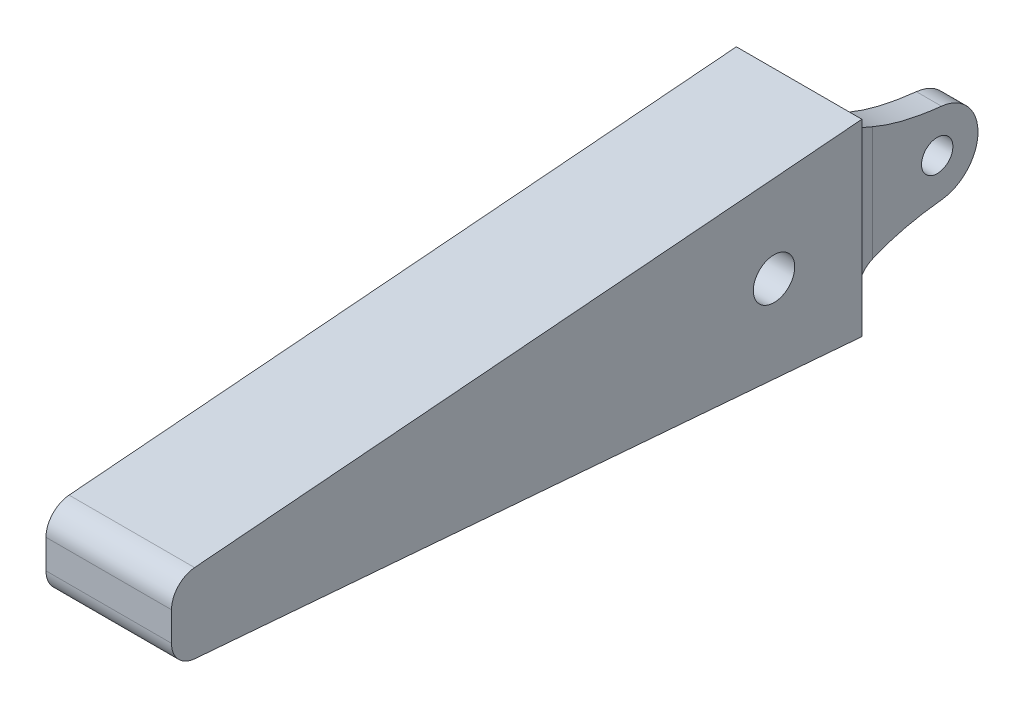
ISO-10303-21;
HEADER;
FILE_DESCRIPTION(('STEP AP214'),'2;1');
FILE_NAME('part.step','',(''),(''),'','','');
FILE_SCHEMA(('AUTOMOTIVE_DESIGN { 1 0 10303 214 1 1 1 1 }'));
ENDSEC;
DATA;
#1=APPLICATION_CONTEXT('core data for automotive mechanical design processes');
#2=APPLICATION_PROTOCOL_DEFINITION('international standard','automotive_design',2000,#1);
#3=PRODUCT_CONTEXT('',#1,'mechanical');
#4=PRODUCT('Part','Part','',(#3));
#5=PRODUCT_RELATED_PRODUCT_CATEGORY('part','',(#4));
#6=PRODUCT_DEFINITION_FORMATION('','',#4);
#7=PRODUCT_DEFINITION_CONTEXT('part definition',#1,'design');
#8=PRODUCT_DEFINITION('design','',#6,#7);
#9=PRODUCT_DEFINITION_SHAPE('','',#8);
#10=(LENGTH_UNIT() NAMED_UNIT(*) SI_UNIT(.MILLI.,.METRE.));
#11=(NAMED_UNIT(*) PLANE_ANGLE_UNIT() SI_UNIT($,.RADIAN.));
#12=(NAMED_UNIT(*) SI_UNIT($,.STERADIAN.) SOLID_ANGLE_UNIT());
#13=UNCERTAINTY_MEASURE_WITH_UNIT(LENGTH_MEASURE(1.E-05),#10,'distance_accuracy_value','');
#14=(GEOMETRIC_REPRESENTATION_CONTEXT(3) GLOBAL_UNCERTAINTY_ASSIGNED_CONTEXT((#13)) GLOBAL_UNIT_ASSIGNED_CONTEXT((#10,
#11,#12)) REPRESENTATION_CONTEXT('',''));
#15=CARTESIAN_POINT('',(0.,0.,0.));
#16=DIRECTION('',(0.,0.,1.));
#17=DIRECTION('',(1.,0.,0.));
#18=AXIS2_PLACEMENT_3D('',#15,#16,#17);
#19=CARTESIAN_POINT('',(0.,7.5,-66.25));
#20=DIRECTION('',(-1.,0.,0.));
#21=DIRECTION('',(0.,0.,-1.));
#22=AXIS2_PLACEMENT_3D('',#19,#20,#21);
#23=PLANE('',#22);
#24=CARTESIAN_POINT('',(0.,0.,-48.));
#25=DIRECTION('',(-1.,0.,0.));
#26=DIRECTION('',(0.,0.,1.));
#27=AXIS2_PLACEMENT_3D('',#24,#25,#26);
#28=CIRCLE('',#27,1.65);
#29=CARTESIAN_POINT('',(0.,0.,-46.35));
#30=VERTEX_POINT('',#29);
#31=EDGE_CURVE('E192',#30,#30,#28,.T.);
#32=ORIENTED_EDGE('',*,*,#31,.F.);
#33=EDGE_LOOP('',(#32));
#34=FACE_BOUND('',#33,.T.);
#35=DIRECTION('',(0.,0.0815456948772206,0.99666960405492));
#36=VECTOR('',#35,1.);
#37=CARTESIAN_POINT('',(0.,-3.,0.));
#38=LINE('',#37,#36);
#39=CARTESIAN_POINT('',(0.,-7.5,-55.));
#40=VERTEX_POINT('',#39);
#41=CARTESIAN_POINT('',(0.,-3.15029252265645,-1.83690861024556));
#42=VERTEX_POINT('',#41);
#43=EDGE_CURVE('E196',#40,#42,#38,.T.);
#44=ORIENTED_EDGE('',*,*,#43,.T.);
#45=CARTESIAN_POINT('',(0.,-1.15695331454661,-2.));
#46=DIRECTION('',(1.,0.,0.));
#47=DIRECTION('',(0.,0.,-1.));
#48=AXIS2_PLACEMENT_3D('',#45,#46,#47);
#49=CIRCLE('',#48,2.);
#50=CARTESIAN_POINT('',(0.,-1.15695331454661,0.));
#51=VERTEX_POINT('',#50);
#52=EDGE_CURVE('E298',#51,#42,#49,.T.);
#53=ORIENTED_EDGE('',*,*,#52,.F.);
#54=DIRECTION('',(0.,1.,0.));
#55=VECTOR('',#54,1.);
#56=CARTESIAN_POINT('',(0.,3.,0.));
#57=LINE('',#56,#55);
#58=CARTESIAN_POINT('',(0.,1.15695331454661,0.));
#59=VERTEX_POINT('',#58);
#60=EDGE_CURVE('E282',#51,#59,#57,.T.);
#61=ORIENTED_EDGE('',*,*,#60,.T.);
#62=CARTESIAN_POINT('',(0.,1.15695331454661,-2.));
#63=DIRECTION('',(1.,0.,0.));
#64=DIRECTION('',(0.,0.,-1.));
#65=AXIS2_PLACEMENT_3D('',#62,#63,#64);
#66=CIRCLE('',#65,2.);
#67=CARTESIAN_POINT('',(0.,3.15029252265645,-1.83690861024556));
#68=VERTEX_POINT('',#67);
#69=EDGE_CURVE('E300',#68,#59,#66,.T.);
#70=ORIENTED_EDGE('',*,*,#69,.F.);
#71=DIRECTION('',(0.,0.0815456948772208,-0.99666960405492));
#72=VECTOR('',#71,1.);
#73=CARTESIAN_POINT('',(0.,3.,0.));
#74=LINE('',#73,#72);
#75=CARTESIAN_POINT('',(0.,7.5,-55.));
#76=VERTEX_POINT('',#75);
#77=EDGE_CURVE('E150',#68,#76,#74,.T.);
#78=ORIENTED_EDGE('',*,*,#77,.T.);
#79=DIRECTION('',(0.,1.,0.));
#80=VECTOR('',#79,1.);
#81=CARTESIAN_POINT('',(0.,-7.5,-55.));
#82=LINE('',#81,#80);
#83=EDGE_CURVE('E176',#40,#76,#82,.T.);
#84=ORIENTED_EDGE('',*,*,#83,.F.);
#85=EDGE_LOOP('',(#44,#53,#61,#70,#78,#84));
#86=FACE_BOUND('',#85,.T.);
#87=ADVANCED_FACE('F43',(#34,#86),#23,.T.);
#88=CARTESIAN_POINT('',(10.,7.5,-66.25));
#89=DIRECTION('',(1.,0.,0.));
#90=DIRECTION('',(0.,0.,1.));
#91=AXIS2_PLACEMENT_3D('',#88,#89,#90);
#92=ELLIPSE('',#91,11.25,4.41819971046751);
#93=DIRECTION('',(-1.,0.,0.));
#94=VECTOR('',#93,1.);
#95=SURFACE_OF_LINEAR_EXTRUSION('',#92,#94);
#96=DIRECTION('',(-1.,0.,0.));
#97=VECTOR('',#96,1.);
#98=CARTESIAN_POINT('',(10.,7.5,-55.));
#99=LINE('',#98,#97);
#100=CARTESIAN_POINT('',(10.,7.5,-55.));
#101=VERTEX_POINT('',#100);
#102=CARTESIAN_POINT('',(3.,7.5,-55.));
#103=VERTEX_POINT('',#102);
#104=EDGE_CURVE('E162',#101,#103,#99,.T.);
#105=ORIENTED_EDGE('',*,*,#104,.F.);
#106=CARTESIAN_POINT('',(8.,4.57055829430097,-57.8284271247462));
#107=CARTESIAN_POINT('',(7.99998641205141,4.61231170109874,-57.7342422779334));
#108=CARTESIAN_POINT('',(8.00443401800137,4.65539920261651,-57.6406771728708));
#109=CARTESIAN_POINT('',(8.0218085903429,4.74410025255541,-57.4556214074317));
#110=CARTESIAN_POINT('',(8.03473023746272,4.78971219991298,-57.3641294829392));
#111=CARTESIAN_POINT('',(8.06852166861428,4.88312584875049,-57.1844097968949));
#112=CARTESIAN_POINT('',(8.08934920522048,4.93091474283163,-57.0961673736677));
#113=CARTESIAN_POINT('',(8.13845260187995,5.02879468476102,-56.9230886279007));
#114=CARTESIAN_POINT('',(8.16672944264326,5.07888603501311,-56.8382527555335));
#115=CARTESIAN_POINT('',(8.23010184643626,5.18112614627208,-56.6727915203997));
#116=CARTESIAN_POINT('',(8.26518003899859,5.23326940194271,-56.5921560816965));
#117=CARTESIAN_POINT('',(8.3416217947351,5.33963951642925,-56.4353610765376));
#118=CARTESIAN_POINT('',(8.38298582494217,5.39386652984289,-56.3592018432442));
#119=CARTESIAN_POINT('',(8.47147304169255,5.50443663296145,-56.2116507095304));
#120=CARTESIAN_POINT('',(8.5186074136953,5.56078368104042,-56.1402684967307));
#121=CARTESIAN_POINT('',(8.61792008694285,5.67545445698582,-56.0028078360521));
#122=CARTESIAN_POINT('',(8.67009840242046,5.73377819042969,-55.9367294031402));
#123=CARTESIAN_POINT('',(8.78455397956834,5.8586898396776,-55.8035074522286));
#124=CARTESIAN_POINT('',(8.8473158493205,5.92550014587185,-55.7369880658503));
#125=CARTESIAN_POINT('',(8.97713906250055,6.06173503285659,-55.6111745935514));
#126=CARTESIAN_POINT('',(9.04420173226874,6.13116041737086,-55.5518827530732));
#127=CARTESIAN_POINT('',(9.18119943948808,6.27281709997283,-55.4410242597028));
#128=CARTESIAN_POINT('',(9.25112624908882,6.34504033213921,-55.3894372186599));
#129=CARTESIAN_POINT('',(9.35694472999718,6.45623023254339,-55.3180114497634));
#130=CARTESIAN_POINT('',(9.39236456401678,6.49376101080114,-55.2951995844919));
#131=CARTESIAN_POINT('',(9.46320336328403,6.5699832705712,-55.2516109329945));
#132=CARTESIAN_POINT('',(9.49862232757024,6.60867454490721,-55.2308337863141));
#133=CARTESIAN_POINT('',(9.55685970606334,6.67387728692579,-55.1982095398632));
#134=CARTESIAN_POINT('',(9.57980223560289,6.69997656954822,-55.1857579238826));
#135=CARTESIAN_POINT('',(9.62533178962184,6.75290564255111,-55.1617908924046));
#136=CARTESIAN_POINT('',(9.64791882368044,6.7797354131944,-55.1502754516461));
#137=CARTESIAN_POINT('',(9.69258529247305,6.83435241770859,-55.128188551392));
#138=CARTESIAN_POINT('',(9.7146629671843,6.86214232438454,-55.1176200808785));
#139=CARTESIAN_POINT('',(9.75790818303054,6.91877570358914,-55.0975337534287));
#140=CARTESIAN_POINT('',(9.77907585041495,6.94761902893865,-55.0880157504674));
#141=CARTESIAN_POINT('',(9.83147789915473,7.02298355903584,-55.0651406181533));
#142=CARTESIAN_POINT('',(9.86178502109528,7.07043780369953,-55.0525816088785));
#143=CARTESIAN_POINT('',(9.90260161251685,7.14447718182678,-55.0363070470531));
#144=CARTESIAN_POINT('',(9.91538948208239,7.16952339419153,-55.0313249801564));
#145=CARTESIAN_POINT('',(9.93893862043277,7.22072238805048,-55.0223076861788));
#146=CARTESIAN_POINT('',(9.94970108153826,7.24687450734162,-55.0182719016926));
#147=CARTESIAN_POINT('',(9.9654584447214,7.29148895770772,-55.0124424143046));
#148=CARTESIAN_POINT('',(9.97118627292643,7.309652954652,-55.0103477973704));
#149=CARTESIAN_POINT('',(9.9812289882331,7.3464142413041,-55.0067017801882));
#150=CARTESIAN_POINT('',(9.98554477527482,7.36501124691287,-55.0051500339071));
#151=CARTESIAN_POINT('',(9.99263103883765,7.40288139741852,-55.002613403762));
#152=CARTESIAN_POINT('',(9.9953729839399,7.42216068172152,-55.001638976282));
#153=CARTESIAN_POINT('',(9.99906807396808,7.46095588417199,-55.0003294815883));
#154=CARTESIAN_POINT('',(10.0000169502031,7.48047225596586,-54.9999959400758));
#155=CARTESIAN_POINT('',(9.99999999999995,7.50000000000002,-55.));
#156=B_SPLINE_CURVE_WITH_KNOTS('',3,(#106,#107,#108,#109,#110,#111,#112,#113,#114,#115,#116,
#117,#118,#119,#120,#121,#122,#123,#124,#125,#126,#127,#128,#129,#130,#131,#132,#133,#134,#135,
#136,#137,#138,#139,#140,#141,#142,#143,#144,#145,#146,#147,#148,#149,#150,#151,#152,#153,#154,
#155),.UNSPECIFIED.,.F.,.F.,(4,2,2,2,2,2,2,2,2,2,2,2,2,2,2,2,2,2,2,2,2,2,2,2,4),(0.,
0.308930728220652,0.617667721766555,0.9247775998507,1.23192792954988,1.53830389987811,
1.84470264484401,2.15170502003694,2.45870826154187,2.79812485764631,3.13764663584185,
3.47625342996982,3.64548417651919,3.81468488907544,3.92540675446813,4.03612563121426,
4.14718249711614,4.25822390554731,4.43084460104401,4.51644644381945,4.60199773564733,
4.6594247526733,4.71681509795985,4.77521541510954,4.83375458937317),.UNSPECIFIED.);
#157=CARTESIAN_POINT('',(7.99999999999999,4.57055829430097,-57.8284271247462));
#158=VERTEX_POINT('',#157);
#159=EDGE_CURVE('E58',#158,#101,#156,.T.);
#160=ORIENTED_EDGE('',*,*,#159,.F.);
#161=CARTESIAN_POINT('',(7.99999999999999,7.5,-66.25));
#162=DIRECTION('',(1.,0.,0.));
#163=DIRECTION('',(0.,0.,1.));
#164=AXIS2_PLACEMENT_3D('',#161,#162,#163);
#165=ELLIPSE('',#164,11.25,4.41819971046751);
#166=CARTESIAN_POINT('',(8.,3.23217471953856,-63.3399214355934));
#167=VERTEX_POINT('',#166);
#168=EDGE_CURVE('E173',#158,#167,#165,.T.);
#169=ORIENTED_EDGE('',*,*,#168,.T.);
#170=DIRECTION('',(-1.,0.,0.));
#171=VECTOR('',#170,1.);
#172=CARTESIAN_POINT('',(10.,3.23217471953856,-63.3399214355934));
#173=LINE('',#172,#171);
#174=CARTESIAN_POINT('',(6.,3.23217471953856,-63.3399214355934));
#175=VERTEX_POINT('',#174);
#176=EDGE_CURVE('E293',#167,#175,#173,.T.);
#177=ORIENTED_EDGE('',*,*,#176,.T.);
#178=CARTESIAN_POINT('',(5.99999999999999,7.5,-66.25));
#179=DIRECTION('',(1.,0.,0.));
#180=DIRECTION('',(0.,0.,1.));
#181=AXIS2_PLACEMENT_3D('',#178,#179,#180);
#182=ELLIPSE('',#181,11.25,4.41819971046751);
#183=CARTESIAN_POINT('',(5.99999999999999,4.49620179485016,-58.));
#184=VERTEX_POINT('',#183);
#185=EDGE_CURVE('E189',#184,#175,#182,.T.);
#186=ORIENTED_EDGE('',*,*,#185,.F.);
#187=CARTESIAN_POINT('',(6.,4.49620179485016,-58.));
#188=CARTESIAN_POINT('',(6.00001148578287,4.53585197766856,-57.9063812135561));
#189=CARTESIAN_POINT('',(5.99561867507821,4.57674324672699,-57.8133164293269));
#190=CARTESIAN_POINT('',(5.97841664445453,4.66085542011966,-57.6290976782259));
#191=CARTESIAN_POINT('',(5.96561231234068,4.7040749581519,-57.5379426333574));
#192=CARTESIAN_POINT('',(5.93205141396605,4.79254535100888,-57.3586251295368));
#193=CARTESIAN_POINT('',(5.91132955088934,4.83778659097918,-57.2704514135642));
#194=CARTESIAN_POINT('',(5.86239390594637,4.93032094173266,-57.0973361472472));
#195=CARTESIAN_POINT('',(5.8341791829951,4.97761430963347,-57.0123950044394));
#196=CARTESIAN_POINT('',(5.73913047889202,5.12215909210721,-56.7636477500786));
#197=CARTESIAN_POINT('',(5.66179218535441,5.22232595452526,-56.6054060175059));
#198=CARTESIAN_POINT('',(5.48323498329976,5.42910005293071,-56.3077354528676));
#199=CARTESIAN_POINT('',(5.38199357679783,5.53571328558506,-56.1683245402011));
#200=CARTESIAN_POINT('',(5.14949688824915,5.76434987254641,-55.8990124826733));
#201=CARTESIAN_POINT('',(5.01632762074144,5.88688492633768,-55.7711962351936));
#202=CARTESIAN_POINT('',(4.7317743685009,6.13679920120996,-55.5435362648494));
#203=CARTESIAN_POINT('',(4.5803763162016,6.26418211097226,-55.4437143461833));
#204=CARTESIAN_POINT('',(4.24842164953749,6.53552395751779,-55.2649498969374));
#205=CARTESIAN_POINT('',(4.06646556937309,6.67985079024615,-55.1891649169074));
#206=CARTESIAN_POINT('',(3.69340229847487,6.9707513553776,-55.0747331636427));
#207=CARTESIAN_POINT('',(3.50231029883719,7.11732110001676,-55.0360268467804));
#208=CARTESIAN_POINT('',(3.20966237111196,7.34054183655985,-55.0056417893827));
#209=CARTESIAN_POINT('',(3.10918649256129,7.41696172277292,-55.0003046251961));
#210=CARTESIAN_POINT('',(3.00581288855382,7.4955792042781,-55.0000042251291));
#211=CARTESIAN_POINT('',(3.00290643567845,7.49778960869393,-55.000000001463));
#212=CARTESIAN_POINT('',(3.,7.5,-55.));
#213=B_SPLINE_CURVE_WITH_KNOTS('',3,(#187,#188,#189,#190,#191,#192,#193,#194,#195,#196,#197,
#198,#199,#200,#201,#202,#203,#204,#205,#206,#207,#208,#209,#210,#211,#212),.UNSPECIFIED.,.F.,
.F.,(4,2,2,2,2,2,2,2,2,2,2,2,4),(0.,0.304864195266043,0.609551395170697,0.912918168025255,
1.21632306104518,1.82141773761751,2.42708422531335,3.08898747749378,3.75140484947259,
4.4812169214151,5.20985503330664,5.58851604539213,5.59947050387073),.UNSPECIFIED.);
#214=EDGE_CURVE('E214',#103,#184,#213,.F.);
#215=ORIENTED_EDGE('',*,*,#214,.F.);
#216=EDGE_LOOP('',(#105,#160,#169,#177,#186,#215));
#217=FACE_BOUND('',#216,.T.);
#218=ADVANCED_FACE('F203',(#217),#95,.T.);
#219=CARTESIAN_POINT('',(10.,0.,-63.));
#220=DIRECTION('',(-1.,0.,0.));
#221=DIRECTION('',(0.,0.,-1.));
#222=AXIS2_PLACEMENT_3D('',#219,#220,#221);
#223=CYLINDRICAL_SURFACE('',#222,3.25);
#224=CARTESIAN_POINT('',(6.,0.,-63.));
#225=DIRECTION('',(-1.,0.,0.));
#226=DIRECTION('',(0.,0.,1.));
#227=AXIS2_PLACEMENT_3D('',#224,#225,#226);
#228=CIRCLE('',#227,3.25);
#229=CARTESIAN_POINT('',(5.99999999999999,-3.23217471953855,-63.3399214355934));
#230=VERTEX_POINT('',#229);
#231=EDGE_CURVE('E186',#175,#230,#228,.T.);
#232=ORIENTED_EDGE('',*,*,#231,.F.);
#233=ORIENTED_EDGE('',*,*,#176,.F.);
#234=CARTESIAN_POINT('',(8.,0.,-63.));
#235=DIRECTION('',(-1.,0.,0.));
#236=DIRECTION('',(0.,0.,1.));
#237=AXIS2_PLACEMENT_3D('',#234,#235,#236);
#238=CIRCLE('',#237,3.25);
#239=CARTESIAN_POINT('',(7.99999999999999,-3.23217471953855,-63.3399214355934));
#240=VERTEX_POINT('',#239);
#241=EDGE_CURVE('E170',#167,#240,#238,.T.);
#242=ORIENTED_EDGE('',*,*,#241,.T.);
#243=DIRECTION('',(-1.,0.,0.));
#244=VECTOR('',#243,1.);
#245=CARTESIAN_POINT('',(10.,-3.23217471953855,-63.3399214355934));
#246=LINE('',#245,#244);
#247=EDGE_CURVE('E161',#240,#230,#246,.T.);
#248=ORIENTED_EDGE('',*,*,#247,.T.);
#249=EDGE_LOOP('',(#232,#233,#242,#248));
#250=FACE_BOUND('',#249,.T.);
#251=ADVANCED_FACE('F208',(#250),#223,.T.);
#252=CARTESIAN_POINT('',(10.,-7.5,-66.25));
#253=DIRECTION('',(1.,0.,0.));
#254=DIRECTION('',(0.,0.,1.));
#255=AXIS2_PLACEMENT_3D('',#252,#253,#254);
#256=ELLIPSE('',#255,11.25,4.41819971046751);
#257=DIRECTION('',(-1.,0.,0.));
#258=VECTOR('',#257,1.);
#259=SURFACE_OF_LINEAR_EXTRUSION('',#256,#258);
#260=ORIENTED_EDGE('',*,*,#247,.F.);
#261=CARTESIAN_POINT('',(7.99999999999999,-7.5,-66.25));
#262=DIRECTION('',(1.,0.,0.));
#263=DIRECTION('',(0.,0.,1.));
#264=AXIS2_PLACEMENT_3D('',#261,#262,#263);
#265=ELLIPSE('',#264,11.25,4.41819971046751);
#266=CARTESIAN_POINT('',(7.99999999999999,-4.57055829430096,-57.8284271247462));
#267=VERTEX_POINT('',#266);
#268=EDGE_CURVE('E166',#240,#267,#265,.T.);
#269=ORIENTED_EDGE('',*,*,#268,.T.);
#270=CARTESIAN_POINT('',(10.,-7.5,-55.));
#271=CARTESIAN_POINT('',(10.0000253880133,-7.47817336278907,-54.999993924121));
#272=CARTESIAN_POINT('',(9.99883578247565,-7.45636602884782,-55.000411573301));
#273=CARTESIAN_POINT('',(9.99423245922203,-7.41308894347188,-55.0020439558149));
#274=CARTESIAN_POINT('',(9.99082626356829,-7.39161830091346,-55.003255993468));
#275=CARTESIAN_POINT('',(9.9820961491871,-7.34965839251331,-55.0063904026957));
#276=CARTESIAN_POINT('',(9.97681882382275,-7.32915791737467,-55.0082955428765));
#277=CARTESIAN_POINT('',(9.96461512455755,-7.2887142771737,-55.0127530133983));
#278=CARTESIAN_POINT('',(9.95768725928379,-7.2687716344662,-55.0153059291841));
#279=CARTESIAN_POINT('',(9.93865067272232,-7.21965442281675,-55.022418335437));
#280=CARTESIAN_POINT('',(9.92568611967866,-7.19086562479429,-55.0273420609757));
#281=CARTESIAN_POINT('',(9.89753084118864,-7.13463048278994,-55.0383034103629));
#282=CARTESIAN_POINT('',(9.88233879169391,-7.10718495029207,-55.0443416972754));
#283=CARTESIAN_POINT('',(9.85016241618741,-7.05313198847667,-55.0574743639354));
#284=CARTESIAN_POINT('',(9.83315722023932,-7.02654024625243,-55.0645815411234));
#285=CARTESIAN_POINT('',(9.79800283408448,-6.97440764624144,-55.0796873520238));
#286=CARTESIAN_POINT('',(9.77985392895716,-6.94886652918003,-55.0876857639672));
#287=CARTESIAN_POINT('',(9.72290222605668,-6.87176692231744,-55.1135073892977));
#288=CARTESIAN_POINT('',(9.68278991546326,-6.82162993371359,-55.1326811584897));
#289=CARTESIAN_POINT('',(9.60100634748563,-6.72392740135028,-55.1741976426823));
#290=CARTESIAN_POINT('',(9.55933280538211,-6.67636589680402,-55.1965451470586));
#291=CARTESIAN_POINT('',(9.4754668658183,-6.58316933595349,-55.2442198574538));
#292=CARTESIAN_POINT('',(9.43327411320116,-6.53753570520451,-55.2695492177415));
#293=CARTESIAN_POINT('',(9.34914434714841,-6.44788881656959,-55.3230016210116));
#294=CARTESIAN_POINT('',(9.30720700370656,-6.40387269823256,-55.3511193712909));
#295=CARTESIAN_POINT('',(9.22400062402567,-6.317136996375,-55.4100756294692));
#296=CARTESIAN_POINT('',(9.18273104648974,-6.27441633536512,-55.4409117880061));
#297=CARTESIAN_POINT('',(9.10118078673143,-6.19007065568032,-55.5052430722019));
#298=CARTESIAN_POINT('',(9.06089993761183,-6.14844545200554,-55.5387377450064));
#299=CARTESIAN_POINT('',(8.9577883374099,-6.04145549441969,-55.6292239731528));
#300=CARTESIAN_POINT('',(8.89594130216857,-5.97684484135411,-55.6882474472751));
#301=CARTESIAN_POINT('',(8.77645999078907,-5.84986380077129,-55.8126605281042));
#302=CARTESIAN_POINT('',(8.7188266401119,-5.78749390691776,-55.8780515260146));
#303=CARTESIAN_POINT('',(8.60857803262829,-5.66487604149713,-56.0149147189808));
#304=CARTESIAN_POINT('',(8.55596652153342,-5.60462967463692,-56.0863913792081));
#305=CARTESIAN_POINT('',(8.45658715651078,-5.4863201329866,-56.2349900124228));
#306=CARTESIAN_POINT('',(8.40981911849457,-5.4282568894613,-56.3121118074485));
#307=CARTESIAN_POINT('',(8.3178935798583,-5.3078821872291,-56.4806382078179));
#308=CARTESIAN_POINT('',(8.27352606713555,-5.24583998884511,-56.5726691572631));
#309=CARTESIAN_POINT('',(8.19391404917704,-5.12471054195943,-56.7623795152926));
#310=CARTESIAN_POINT('',(8.15866472791445,-5.06562174689619,-56.8600559085866));
#311=CARTESIAN_POINT('',(8.09821429953137,-4.95067092034472,-57.0599732071001));
#312=CARTESIAN_POINT('',(8.07298970710044,-4.89480161238673,-57.1622028124022));
#313=CARTESIAN_POINT('',(8.03328915581918,-4.78635491928488,-57.3703511289401));
#314=CARTESIAN_POINT('',(8.01880345166635,-4.73377458924744,-57.4762664038878));
#315=CARTESIAN_POINT('',(8.00669910815006,-4.66369390472132,-57.6239581753709));
#316=CARTESIAN_POINT('',(8.00419305931585,-4.64470620128167,-57.6646745692054));
#317=CARTESIAN_POINT('',(8.00084452720337,-4.60724869589028,-57.7463633557744));
#318=CARTESIAN_POINT('',(8.00000038244688,-4.58877839490359,-57.7873354517082));
#319=CARTESIAN_POINT('',(7.99999999999998,-4.57055829430096,-57.8284271247462));
#320=B_SPLINE_CURVE_WITH_KNOTS('',3,(#270,#271,#272,#273,#274,#275,#276,#277,#278,#279,#280,
#281,#282,#283,#284,#285,#286,#287,#288,#289,#290,#291,#292,#293,#294,#295,#296,#297,#298,#299,
#300,#301,#302,#303,#304,#305,#306,#307,#308,#309,#310,#311,#312,#313,#314,#315,#316,#317,#318,
#319),.UNSPECIFIED.,.F.,.F.,(4,2,2,2,2,2,2,2,2,2,2,2,2,2,2,2,2,2,2,2,2,2,2,2,4),(0.,
0.0654127569902757,0.130604683411103,0.194275715800655,0.258004498876245,0.353693044269377,
0.449438700320887,0.546438502339684,0.643414221223364,0.844215092500309,1.04532227060224,
1.2465756425142,1.44745406825892,1.6481605572469,1.84883293071948,2.17000632717528,
2.49125005306889,2.81273154729129,3.13420291124396,3.4922850431406,3.85017765601651,
4.20722680670772,4.56395154526641,4.69891226836904,4.83373799667749),.UNSPECIFIED.);
#321=CARTESIAN_POINT('',(10.,-7.5,-55.));
#322=VERTEX_POINT('',#321);
#323=EDGE_CURVE('E11',#322,#267,#320,.T.);
#324=ORIENTED_EDGE('',*,*,#323,.F.);
#325=DIRECTION('',(-1.,0.,0.));
#326=VECTOR('',#325,1.);
#327=CARTESIAN_POINT('',(10.,-7.5,-55.));
#328=LINE('',#327,#326);
#329=CARTESIAN_POINT('',(3.,-7.5,-55.));
#330=VERTEX_POINT('',#329);
#331=EDGE_CURVE('E154',#322,#330,#328,.T.);
#332=ORIENTED_EDGE('',*,*,#331,.T.);
#333=CARTESIAN_POINT('',(6.,-4.49620179485015,-58.));
#334=CARTESIAN_POINT('',(6.00001148578287,-4.53585197766851,-57.9063812135562));
#335=CARTESIAN_POINT('',(5.99561867507822,-4.5767432467269,-57.8133164293271));
#336=CARTESIAN_POINT('',(5.97841664445457,-4.66085542011949,-57.6290976782263));
#337=CARTESIAN_POINT('',(5.96561231234074,-4.7040749581517,-57.5379426333578));
#338=CARTESIAN_POINT('',(5.93205141396615,-4.79254535100867,-57.3586251295372));
#339=CARTESIAN_POINT('',(5.91132955088942,-4.83778659097901,-57.2704514135645));
#340=CARTESIAN_POINT('',(5.86239390594643,-4.93032094173257,-57.0973361472474));
#341=CARTESIAN_POINT('',(5.83417918299513,-4.97761430963342,-57.0123950044394));
#342=CARTESIAN_POINT('',(5.73913047889199,-5.12215909210724,-56.7636477500785));
#343=CARTESIAN_POINT('',(5.66179218535432,-5.22232595452533,-56.6054060175057));
#344=CARTESIAN_POINT('',(5.48323498329967,-5.42910005293083,-56.3077354528674));
#345=CARTESIAN_POINT('',(5.38199357679783,-5.53571328558519,-56.1683245402011));
#346=CARTESIAN_POINT('',(5.14949688824916,-5.76434987254621,-55.8990124826734));
#347=CARTESIAN_POINT('',(5.01632762074135,-5.88688492633712,-55.7711962351938));
#348=CARTESIAN_POINT('',(4.73177436850139,-6.13679920121014,-55.5435362648496));
#349=CARTESIAN_POINT('',(4.58037631620276,-6.26418211097354,-55.4437143461834));
#350=CARTESIAN_POINT('',(4.24842164953622,-6.53552395751633,-55.2649498969373));
#351=CARTESIAN_POINT('',(4.06646556936834,-6.67985079024034,-55.1891649169073));
#352=CARTESIAN_POINT('',(3.69340229847918,-6.97075135538373,-55.0747331636426));
#353=CARTESIAN_POINT('',(3.50231029885405,-7.11732110003914,-55.0360268467803));
#354=CARTESIAN_POINT('',(3.20966237110306,-7.34054183654813,-55.0056417893827));
#355=CARTESIAN_POINT('',(3.10918649253557,-7.4169617227391,-55.0003046251962));
#356=CARTESIAN_POINT('',(3.00581288855235,-7.49557920427617,-55.0000042251292));
#357=CARTESIAN_POINT('',(3.0029064356777,-7.49778960869294,-55.000000001463));
#358=CARTESIAN_POINT('',(3.,-7.5,-55.));
#359=B_SPLINE_CURVE_WITH_KNOTS('',3,(#333,#334,#335,#336,#337,#338,#339,#340,#341,#342,#343,
#344,#345,#346,#347,#348,#349,#350,#351,#352,#353,#354,#355,#356,#357,#358),.UNSPECIFIED.,.F.,
.F.,(4,2,2,2,2,2,2,2,2,2,2,2,4),(0.,0.304864195265767,0.609551395170143,0.912918168024981,
1.21632306104518,1.82141773761783,2.42708422531335,3.08898747749331,3.75140484947258,
4.48121692141552,5.20985503330663,5.58851604539213,5.59947050387073),.UNSPECIFIED.);
#360=CARTESIAN_POINT('',(5.99999999999999,-4.49620179485015,-58.));
#361=VERTEX_POINT('',#360);
#362=EDGE_CURVE('E225',#361,#330,#359,.T.);
#363=ORIENTED_EDGE('',*,*,#362,.F.);
#364=CARTESIAN_POINT('',(5.99999999999999,-7.5,-66.25));
#365=DIRECTION('',(1.,0.,0.));
#366=DIRECTION('',(0.,0.,1.));
#367=AXIS2_PLACEMENT_3D('',#364,#365,#366);
#368=ELLIPSE('',#367,11.25,4.41819971046751);
#369=EDGE_CURVE('E183',#230,#361,#368,.T.);
#370=ORIENTED_EDGE('',*,*,#369,.F.);
#371=EDGE_LOOP('',(#260,#269,#324,#332,#363,#370));
#372=FACE_BOUND('',#371,.T.);
#373=ADVANCED_FACE('F165',(#372),#259,.T.);
#374=CARTESIAN_POINT('',(10.,7.5,-66.25));
#375=DIRECTION('',(-1.,0.,0.));
#376=DIRECTION('',(0.,0.,-1.));
#377=AXIS2_PLACEMENT_3D('',#374,#375,#376);
#378=PLANE('',#377);
#379=DIRECTION('',(0.,0.0815456948772208,-0.99666960405492));
#380=VECTOR('',#379,1.);
#381=CARTESIAN_POINT('',(10.,3.,0.));
#382=LINE('',#381,#380);
#383=CARTESIAN_POINT('',(10.,3.15029252265645,-1.83690861024556));
#384=VERTEX_POINT('',#383);
#385=EDGE_CURVE('E287',#384,#101,#382,.T.);
#386=ORIENTED_EDGE('',*,*,#385,.F.);
#387=CARTESIAN_POINT('',(10.,1.15695331454661,-2.));
#388=DIRECTION('',(1.,0.,0.));
#389=DIRECTION('',(0.,0.,-1.));
#390=AXIS2_PLACEMENT_3D('',#387,#388,#389);
#391=CIRCLE('',#390,2.);
#392=CARTESIAN_POINT('',(10.,1.15695331454661,0.));
#393=VERTEX_POINT('',#392);
#394=EDGE_CURVE('E308',#393,#384,#391,.F.);
#395=ORIENTED_EDGE('',*,*,#394,.F.);
#396=DIRECTION('',(0.,1.,0.));
#397=VECTOR('',#396,1.);
#398=CARTESIAN_POINT('',(10.,3.,0.));
#399=LINE('',#398,#397);
#400=CARTESIAN_POINT('',(10.,-1.15695331454661,0.));
#401=VERTEX_POINT('',#400);
#402=EDGE_CURVE('E149',#401,#393,#399,.T.);
#403=ORIENTED_EDGE('',*,*,#402,.F.);
#404=CARTESIAN_POINT('',(10.,-1.15695331454661,-2.));
#405=DIRECTION('',(1.,0.,0.));
#406=DIRECTION('',(0.,0.,-1.));
#407=AXIS2_PLACEMENT_3D('',#404,#405,#406);
#408=CIRCLE('',#407,2.);
#409=CARTESIAN_POINT('',(10.,-3.15029252265645,-1.83690861024556));
#410=VERTEX_POINT('',#409);
#411=EDGE_CURVE('E147',#410,#401,#408,.F.);
#412=ORIENTED_EDGE('',*,*,#411,.F.);
#413=DIRECTION('',(0.,0.0815456948772206,0.99666960405492));
#414=VECTOR('',#413,1.);
#415=CARTESIAN_POINT('',(10.,-3.,0.));
#416=LINE('',#415,#414);
#417=EDGE_CURVE('E141',#322,#410,#416,.T.);
#418=ORIENTED_EDGE('',*,*,#417,.F.);
#419=DIRECTION('',(0.,1.,0.));
#420=VECTOR('',#419,1.);
#421=CARTESIAN_POINT('',(10.,-7.5,-55.));
#422=LINE('',#421,#420);
#423=EDGE_CURVE('E65',#322,#101,#422,.T.);
#424=ORIENTED_EDGE('',*,*,#423,.T.);
#425=EDGE_LOOP('',(#386,#395,#403,#412,#418,#424));
#426=FACE_BOUND('',#425,.T.);
#427=CARTESIAN_POINT('',(10.,0.,-48.));
#428=DIRECTION('',(-1.,0.,0.));
#429=DIRECTION('',(0.,0.,1.));
#430=AXIS2_PLACEMENT_3D('',#427,#428,#429);
#431=CIRCLE('',#430,1.65);
#432=CARTESIAN_POINT('',(10.,0.,-46.35));
#433=VERTEX_POINT('',#432);
#434=EDGE_CURVE('E193',#433,#433,#431,.T.);
#435=ORIENTED_EDGE('',*,*,#434,.T.);
#436=EDGE_LOOP('',(#435));
#437=FACE_BOUND('',#436,.T.);
#438=ADVANCED_FACE('F143',(#426,#437),#378,.F.);
#439=CARTESIAN_POINT('',(10.,-3.,0.));
#440=DIRECTION('',(0.,0.99666960405492,-0.0815456948772206));
#441=DIRECTION('',(0.,-0.0815456948772206,-0.99666960405492));
#442=AXIS2_PLACEMENT_3D('',#439,#440,#441);
#443=PLANE('',#442);
#444=ORIENTED_EDGE('',*,*,#43,.F.);
#445=DIRECTION('',(1.,0.,0.));
#446=VECTOR('',#445,1.);
#447=CARTESIAN_POINT('',(0.,-7.5,-55.));
#448=LINE('',#447,#446);
#449=EDGE_CURVE('E157',#40,#330,#448,.T.);
#450=ORIENTED_EDGE('',*,*,#449,.T.);
#451=ORIENTED_EDGE('',*,*,#331,.F.);
#452=ORIENTED_EDGE('',*,*,#417,.T.);
#453=DIRECTION('',(-1.,0.,0.));
#454=VECTOR('',#453,1.);
#455=CARTESIAN_POINT('',(10.,-3.15029252265645,-1.83690861024556));
#456=LINE('',#455,#454);
#457=EDGE_CURVE('E280',#42,#410,#456,.F.);
#458=ORIENTED_EDGE('',*,*,#457,.F.);
#459=EDGE_LOOP('',(#444,#450,#451,#452,#458));
#460=FACE_BOUND('',#459,.T.);
#461=ADVANCED_FACE('F156',(#460),#443,.F.);
#462=CARTESIAN_POINT('',(10.,3.,0.));
#463=DIRECTION('',(0.,0.,-1.));
#464=DIRECTION('',(1.,0.,0.));
#465=AXIS2_PLACEMENT_3D('',#462,#463,#464);
#466=PLANE('',#465);
#467=ORIENTED_EDGE('',*,*,#60,.F.);
#468=DIRECTION('',(-1.,0.,0.));
#469=VECTOR('',#468,1.);
#470=CARTESIAN_POINT('',(10.,-1.15695331454661,0.));
#471=LINE('',#470,#469);
#472=EDGE_CURVE('E303',#401,#51,#471,.T.);
#473=ORIENTED_EDGE('',*,*,#472,.F.);
#474=ORIENTED_EDGE('',*,*,#402,.T.);
#475=DIRECTION('',(-1.,0.,0.));
#476=VECTOR('',#475,1.);
#477=CARTESIAN_POINT('',(10.,1.15695331454661,0.));
#478=LINE('',#477,#476);
#479=EDGE_CURVE('E305',#59,#393,#478,.F.);
#480=ORIENTED_EDGE('',*,*,#479,.F.);
#481=EDGE_LOOP('',(#467,#473,#474,#480));
#482=FACE_BOUND('',#481,.T.);
#483=ADVANCED_FACE('F238',(#482),#466,.F.);
#484=CARTESIAN_POINT('',(10.,3.,0.));
#485=DIRECTION('',(0.,-0.99666960405492,-0.0815456948772208));
#486=DIRECTION('',(0.,-0.0815456948772208,0.99666960405492));
#487=AXIS2_PLACEMENT_3D('',#484,#485,#486);
#488=PLANE('',#487);
#489=ORIENTED_EDGE('',*,*,#385,.T.);
#490=ORIENTED_EDGE('',*,*,#104,.T.);
#491=DIRECTION('',(1.,0.,0.));
#492=VECTOR('',#491,1.);
#493=CARTESIAN_POINT('',(0.,7.5,-55.));
#494=LINE('',#493,#492);
#495=EDGE_CURVE('E130',#76,#103,#494,.T.);
#496=ORIENTED_EDGE('',*,*,#495,.F.);
#497=ORIENTED_EDGE('',*,*,#77,.F.);
#498=DIRECTION('',(-1.,0.,0.));
#499=VECTOR('',#498,1.);
#500=CARTESIAN_POINT('',(10.,3.15029252265645,-1.83690861024556));
#501=LINE('',#500,#499);
#502=EDGE_CURVE('E296',#384,#68,#501,.T.);
#503=ORIENTED_EDGE('',*,*,#502,.F.);
#504=EDGE_LOOP('',(#489,#490,#496,#497,#503));
#505=FACE_BOUND('',#504,.T.);
#506=ADVANCED_FACE('F241',(#505),#488,.F.);
#507=CARTESIAN_POINT('',(10.,0.,-48.));
#508=DIRECTION('',(-1.,0.,0.));
#509=DIRECTION('',(0.,0.,-1.));
#510=AXIS2_PLACEMENT_3D('',#507,#508,#509);
#511=CYLINDRICAL_SURFACE('',#510,1.65);
#512=ORIENTED_EDGE('',*,*,#434,.F.);
#513=EDGE_LOOP('',(#512));
#514=FACE_BOUND('',#513,.T.);
#515=ORIENTED_EDGE('',*,*,#31,.T.);
#516=EDGE_LOOP('',(#515));
#517=FACE_BOUND('',#516,.T.);
#518=ADVANCED_FACE('F245',(#514,#517),#511,.F.);
#519=CARTESIAN_POINT('',(10.,1.15695331454661,-2.));
#520=DIRECTION('',(-1.,0.,0.));
#521=DIRECTION('',(0.,0.,-1.));
#522=AXIS2_PLACEMENT_3D('',#519,#520,#521);
#523=CYLINDRICAL_SURFACE('',#522,2.);
#524=ORIENTED_EDGE('',*,*,#394,.T.);
#525=ORIENTED_EDGE('',*,*,#502,.T.);
#526=ORIENTED_EDGE('',*,*,#69,.T.);
#527=ORIENTED_EDGE('',*,*,#479,.T.);
#528=EDGE_LOOP('',(#524,#525,#526,#527));
#529=FACE_BOUND('',#528,.T.);
#530=ADVANCED_FACE('F210',(#529),#523,.T.);
#531=CARTESIAN_POINT('',(10.,-1.15695331454661,-2.));
#532=DIRECTION('',(-1.,0.,0.));
#533=DIRECTION('',(0.,0.,-1.));
#534=AXIS2_PLACEMENT_3D('',#531,#532,#533);
#535=CYLINDRICAL_SURFACE('',#534,2.);
#536=ORIENTED_EDGE('',*,*,#411,.T.);
#537=ORIENTED_EDGE('',*,*,#472,.T.);
#538=ORIENTED_EDGE('',*,*,#52,.T.);
#539=ORIENTED_EDGE('',*,*,#457,.T.);
#540=EDGE_LOOP('',(#536,#537,#538,#539));
#541=FACE_BOUND('',#540,.T.);
#542=ADVANCED_FACE('F263',(#541),#535,.T.);
#543=CARTESIAN_POINT('',(7.99999999999999,-7.5,0.));
#544=DIRECTION('',(1.,0.,0.));
#545=DIRECTION('',(0.,0.,1.));
#546=AXIS2_PLACEMENT_3D('',#543,#544,#545);
#547=PLANE('',#546);
#548=CARTESIAN_POINT('',(8.,0.,-63.));
#549=DIRECTION('',(-1.,0.,0.));
#550=DIRECTION('',(0.,0.,1.));
#551=AXIS2_PLACEMENT_3D('',#548,#549,#550);
#552=CIRCLE('',#551,1.25);
#553=CARTESIAN_POINT('',(8.,0.,-61.75));
#554=VERTEX_POINT('',#553);
#555=EDGE_CURVE('E171',#554,#554,#552,.T.);
#556=ORIENTED_EDGE('',*,*,#555,.T.);
#557=EDGE_LOOP('',(#556));
#558=FACE_BOUND('',#557,.T.);
#559=ORIENTED_EDGE('',*,*,#268,.F.);
#560=ORIENTED_EDGE('',*,*,#241,.F.);
#561=ORIENTED_EDGE('',*,*,#168,.F.);
#562=DIRECTION('',(0.,-1.,0.));
#563=VECTOR('',#562,1.);
#564=CARTESIAN_POINT('',(8.,7.5,-57.8284271247462));
#565=LINE('',#564,#563);
#566=EDGE_CURVE('E316',#267,#158,#565,.F.);
#567=ORIENTED_EDGE('',*,*,#566,.F.);
#568=EDGE_LOOP('',(#559,#560,#561,#567));
#569=FACE_BOUND('',#568,.T.);
#570=ADVANCED_FACE('F259',(#558,#569),#547,.T.);
#571=CARTESIAN_POINT('',(5.99999999999999,-7.5,0.));
#572=DIRECTION('',(1.,0.,0.));
#573=DIRECTION('',(0.,0.,1.));
#574=AXIS2_PLACEMENT_3D('',#571,#572,#573);
#575=PLANE('',#574);
#576=CARTESIAN_POINT('',(6.,0.,-63.));
#577=DIRECTION('',(-1.,0.,0.));
#578=DIRECTION('',(0.,0.,1.));
#579=AXIS2_PLACEMENT_3D('',#576,#577,#578);
#580=CIRCLE('',#579,1.25);
#581=CARTESIAN_POINT('',(6.,0.,-61.75));
#582=VERTEX_POINT('',#581);
#583=EDGE_CURVE('E182',#582,#582,#580,.T.);
#584=ORIENTED_EDGE('',*,*,#583,.F.);
#585=EDGE_LOOP('',(#584));
#586=FACE_BOUND('',#585,.T.);
#587=ORIENTED_EDGE('',*,*,#185,.T.);
#588=ORIENTED_EDGE('',*,*,#231,.T.);
#589=ORIENTED_EDGE('',*,*,#369,.T.);
#590=DIRECTION('',(0.,1.,0.));
#591=VECTOR('',#590,1.);
#592=CARTESIAN_POINT('',(6.,-7.5,-58.));
#593=LINE('',#592,#591);
#594=EDGE_CURVE('E315',#184,#361,#593,.F.);
#595=ORIENTED_EDGE('',*,*,#594,.F.);
#596=EDGE_LOOP('',(#587,#588,#589,#595));
#597=FACE_BOUND('',#596,.T.);
#598=ADVANCED_FACE('F262',(#586,#597),#575,.F.);
#599=CARTESIAN_POINT('',(0.,-7.5,-55.));
#600=DIRECTION('',(0.,0.,-1.));
#601=DIRECTION('',(1.,0.,0.));
#602=AXIS2_PLACEMENT_3D('',#599,#600,#601);
#603=PLANE('',#602);
#604=ORIENTED_EDGE('',*,*,#449,.F.);
#605=ORIENTED_EDGE('',*,*,#83,.T.);
#606=ORIENTED_EDGE('',*,*,#495,.T.);
#607=DIRECTION('',(0.,1.,0.));
#608=VECTOR('',#607,1.);
#609=CARTESIAN_POINT('',(3.,-7.5,-55.));
#610=LINE('',#609,#608);
#611=EDGE_CURVE('E274',#330,#103,#610,.T.);
#612=ORIENTED_EDGE('',*,*,#611,.F.);
#613=EDGE_LOOP('',(#604,#605,#606,#612));
#614=FACE_BOUND('',#613,.T.);
#615=ADVANCED_FACE('F254',(#614),#603,.T.);
#616=CARTESIAN_POINT('',(10.,0.,-63.));
#617=DIRECTION('',(-1.,0.,0.));
#618=DIRECTION('',(0.,0.,-1.));
#619=AXIS2_PLACEMENT_3D('',#616,#617,#618);
#620=CYLINDRICAL_SURFACE('',#619,1.25);
#621=ORIENTED_EDGE('',*,*,#583,.T.);
#622=EDGE_LOOP('',(#621));
#623=FACE_BOUND('',#622,.T.);
#624=ORIENTED_EDGE('',*,*,#555,.F.);
#625=EDGE_LOOP('',(#624));
#626=FACE_BOUND('',#625,.T.);
#627=ADVANCED_FACE('F251',(#623,#626),#620,.F.);
#628=CARTESIAN_POINT('',(3.,-7.5,-58.));
#629=DIRECTION('',(0.,1.,0.));
#630=DIRECTION('',(0.,0.,-1.));
#631=AXIS2_PLACEMENT_3D('',#628,#629,#630);
#632=CYLINDRICAL_SURFACE('',#631,3.);
#633=ORIENTED_EDGE('',*,*,#362,.T.);
#634=ORIENTED_EDGE('',*,*,#611,.T.);
#635=ORIENTED_EDGE('',*,*,#214,.T.);
#636=ORIENTED_EDGE('',*,*,#594,.T.);
#637=EDGE_LOOP('',(#633,#634,#635,#636));
#638=FACE_BOUND('',#637,.T.);
#639=ADVANCED_FACE('F230',(#638),#632,.F.);
#640=CARTESIAN_POINT('',(11.,-7.5,-57.8284271247462));
#641=DIRECTION('',(0.,1.,0.));
#642=DIRECTION('',(0.,0.,-1.));
#643=AXIS2_PLACEMENT_3D('',#640,#641,#642);
#644=CYLINDRICAL_SURFACE('',#643,3.);
#645=ORIENTED_EDGE('',*,*,#323,.T.);
#646=ORIENTED_EDGE('',*,*,#566,.T.);
#647=ORIENTED_EDGE('',*,*,#159,.T.);
#648=ORIENTED_EDGE('',*,*,#423,.F.);
#649=EDGE_LOOP('',(#645,#646,#647,#648));
#650=FACE_BOUND('',#649,.T.);
#651=ADVANCED_FACE('F45',(#650),#644,.F.);
#652=CLOSED_SHELL('',(#87,#218,#251,#373,#438,#461,#483,#506,#518,#530,#542,#570,#598,#615,#627,
#639,#651));
#653=MANIFOLD_SOLID_BREP('B2',#652);
#654=ADVANCED_BREP_SHAPE_REPRESENTATION('',(#18,#653),#14);
#655=SHAPE_DEFINITION_REPRESENTATION(#9,#654);
ENDSEC;
END-ISO-10303-21;
